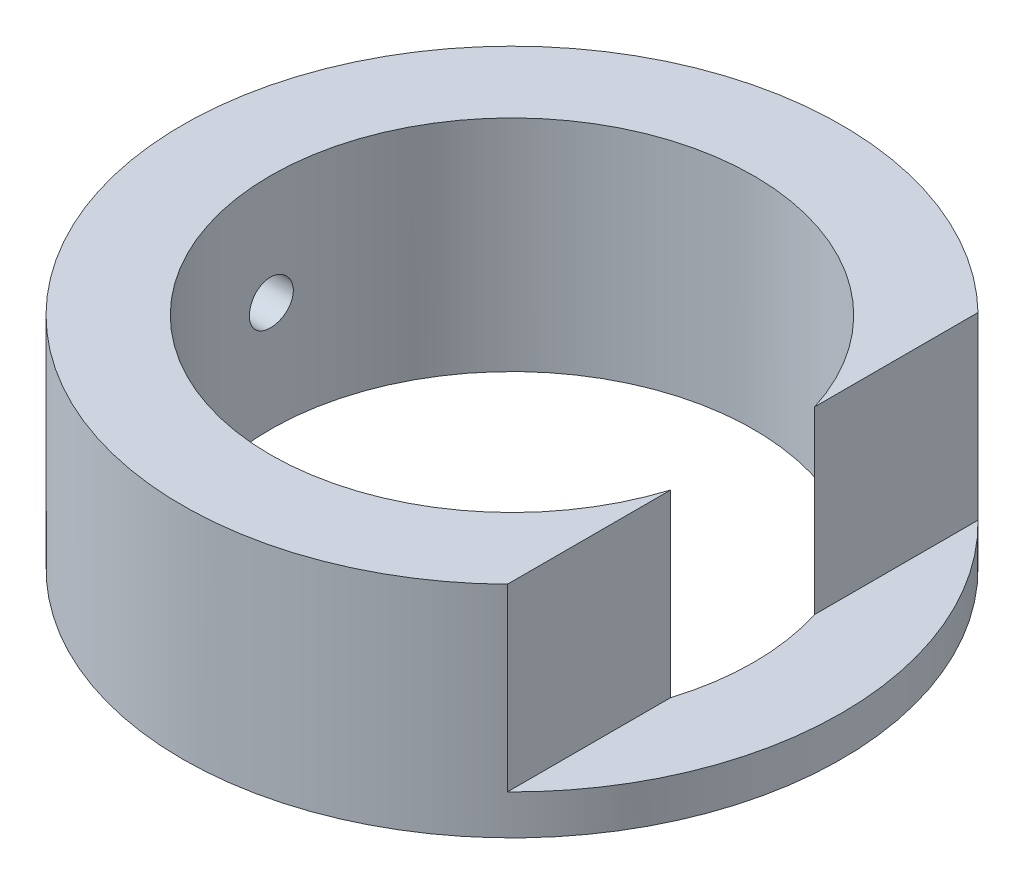
ISO-10303-21;
HEADER;
FILE_DESCRIPTION(('STEP AP214'),'2;1');
FILE_NAME('part.step','',(''),(''),'','','');
FILE_SCHEMA(('AUTOMOTIVE_DESIGN { 1 0 10303 214 1 1 1 1 }'));
ENDSEC;
DATA;
#1=APPLICATION_CONTEXT('core data for automotive mechanical design processes');
#2=APPLICATION_PROTOCOL_DEFINITION('international standard','automotive_design',2000,#1);
#3=PRODUCT_CONTEXT('',#1,'mechanical');
#4=PRODUCT('Part','Part','',(#3));
#5=PRODUCT_RELATED_PRODUCT_CATEGORY('part','',(#4));
#6=PRODUCT_DEFINITION_FORMATION('','',#4);
#7=PRODUCT_DEFINITION_CONTEXT('part definition',#1,'design');
#8=PRODUCT_DEFINITION('design','',#6,#7);
#9=PRODUCT_DEFINITION_SHAPE('','',#8);
#10=(LENGTH_UNIT() NAMED_UNIT(*) SI_UNIT(.MILLI.,.METRE.));
#11=(NAMED_UNIT(*) PLANE_ANGLE_UNIT() SI_UNIT($,.RADIAN.));
#12=(NAMED_UNIT(*) SI_UNIT($,.STERADIAN.) SOLID_ANGLE_UNIT());
#13=UNCERTAINTY_MEASURE_WITH_UNIT(LENGTH_MEASURE(1.E-05),#10,'distance_accuracy_value','');
#14=(GEOMETRIC_REPRESENTATION_CONTEXT(3) GLOBAL_UNCERTAINTY_ASSIGNED_CONTEXT((#13)) GLOBAL_UNIT_ASSIGNED_CONTEXT((#10,
#11,#12)) REPRESENTATION_CONTEXT('',''));
#15=CARTESIAN_POINT('',(0.,0.,0.));
#16=DIRECTION('',(0.,0.,1.));
#17=DIRECTION('',(1.,0.,0.));
#18=AXIS2_PLACEMENT_3D('',#15,#16,#17);
#19=CARTESIAN_POINT('',(0.,8.,0.));
#20=DIRECTION('',(0.,-1.,0.));
#21=DIRECTION('',(0.,0.,-1.));
#22=AXIS2_PLACEMENT_3D('',#19,#20,#21);
#23=CYLINDRICAL_SURFACE('',#22,24.);
#24=CARTESIAN_POINT('',(-23.9466072753532,0.,-1.6));
#25=CARTESIAN_POINT('',(-23.9466079884567,0.089765495326951,-1.59999605489651));
#26=CARTESIAN_POINT('',(-23.9471174424527,0.179593536191976,-1.59242038032986));
#27=CARTESIAN_POINT('',(-23.9491004050786,0.356768348813025,-1.56230876160442));
#28=CARTESIAN_POINT('',(-23.9505750305274,0.444112123656424,-1.539755486128));
#29=CARTESIAN_POINT('',(-23.9543205686877,0.613726414287811,-1.48034014706031));
#30=CARTESIAN_POINT('',(-23.9565910555038,0.695999615897359,-1.44348573542061));
#31=CARTESIAN_POINT('',(-23.9616719480995,0.853170896685812,-1.35652689360413));
#32=CARTESIAN_POINT('',(-23.9644822316654,0.928070639469401,-1.30642546167468));
#33=CARTESIAN_POINT('',(-23.9703314336049,1.06851673947136,-1.194302203398));
#34=CARTESIAN_POINT('',(-23.9733706872729,1.13404895613161,-1.13226268052111));
#35=CARTESIAN_POINT('',(-23.9793322683734,1.25377866448456,-0.998061063479044));
#36=CARTESIAN_POINT('',(-23.9822545908843,1.30797567948711,-0.925898543814863));
#37=CARTESIAN_POINT('',(-23.987655988035,1.40354067991656,-0.773418683512618));
#38=CARTESIAN_POINT('',(-23.9901346541588,1.44489686707094,-0.693093932733775));
#39=CARTESIAN_POINT('',(-23.9943659047901,1.51353073724957,-0.526621652966222));
#40=CARTESIAN_POINT('',(-23.9961184979421,1.5408085878893,-0.440474193316007));
#41=CARTESIAN_POINT('',(-23.9986978083835,1.58047196127163,-0.264938984695941));
#42=CARTESIAN_POINT('',(-23.9995259110076,1.59287976859937,-0.175556291756176));
#43=CARTESIAN_POINT('',(-24.0001676046847,1.60251967440014,0.00402670339663554));
#44=CARTESIAN_POINT('',(-23.9999812084918,1.59975196365559,0.0942269953168214));
#45=CARTESIAN_POINT('',(-23.9986160607391,1.57913775159132,0.272733763022197));
#46=CARTESIAN_POINT('',(-23.9974388866786,1.56131522013132,0.361043020617371));
#47=CARTESIAN_POINT('',(-23.9942265068173,1.51113449308461,0.533413663499482));
#48=CARTESIAN_POINT('',(-23.9921912953873,1.47877620213524,0.617475020913808));
#49=CARTESIAN_POINT('',(-23.9874892415061,1.40041542248772,0.779040497774637));
#50=CARTESIAN_POINT('',(-23.9848218975772,1.35440209375073,0.856539344515155));
#51=CARTESIAN_POINT('',(-23.9791556905921,1.25004527072849,1.00272231691473));
#52=CARTESIAN_POINT('',(-23.9761568232742,1.19170161793367,1.07140632923851));
#53=CARTESIAN_POINT('',(-23.9701580988274,1.06420498179405,1.19814989242806));
#54=CARTESIAN_POINT('',(-23.9671582511236,0.995031189379639,1.25618851308097));
#55=CARTESIAN_POINT('',(-23.9615015967701,0.847910699888306,1.35983235701574));
#56=CARTESIAN_POINT('',(-23.9588447902779,0.769963998781157,1.40543757458572));
#57=CARTESIAN_POINT('',(-23.9541742979447,0.607496761954464,1.48291867986946));
#58=CARTESIAN_POINT('',(-23.9521606550984,0.522975787223211,1.51479364978464));
#59=CARTESIAN_POINT('',(-23.9490050653016,0.349765503836451,1.56389481105159));
#60=CARTESIAN_POINT('',(-23.9478631066752,0.261076251031674,1.58112119862058));
#61=CARTESIAN_POINT('',(-23.9465818624714,0.0822296469810546,1.60041005065297));
#62=CARTESIAN_POINT('',(-23.946440652044,-0.00792455145452667,1.60250162574417));
#63=CARTESIAN_POINT('',(-23.9471717988874,-0.187302461379629,1.59153757461965));
#64=CARTESIAN_POINT('',(-23.9480441501465,-0.276526178384896,1.57848203824512));
#65=CARTESIAN_POINT('',(-23.9507023581874,-0.451427849937443,1.53761856010096));
#66=CARTESIAN_POINT('',(-23.9524873827678,-0.537108957941355,1.50982405688409));
#67=CARTESIAN_POINT('',(-23.9567690828779,-0.702590635022812,1.44028524943134));
#68=CARTESIAN_POINT('',(-23.9592657657492,-0.782391143425741,1.39854080128788));
#69=CARTESIAN_POINT('',(-23.964694106991,-0.933980006485567,1.30221281474259));
#70=CARTESIAN_POINT('',(-23.9676264230349,-1.00575595427775,1.2476097895846));
#71=CARTESIAN_POINT('',(-23.9735933093218,-1.13913318506514,1.12714295121444));
#72=CARTESIAN_POINT('',(-23.9766278806993,-1.20073435512037,1.0612790130227));
#73=CARTESIAN_POINT('',(-23.9824629814962,-1.31211191270268,0.920034605243947));
#74=CARTESIAN_POINT('',(-23.9852631332633,-1.36186944895695,0.844639252858362));
#75=CARTESIAN_POINT('',(-23.9903084513225,-1.44801824717356,0.686546932795258));
#76=CARTESIAN_POINT('',(-23.9925536214191,-1.48440960076502,0.603850015176943));
#77=CARTESIAN_POINT('',(-23.9962342108733,-1.54276029925169,0.433571018967644));
#78=CARTESIAN_POINT('',(-23.9976702967788,-1.56473152634671,0.34599302711624));
#79=CARTESIAN_POINT('',(-23.9995735734135,-1.59365716637005,0.168381219638007));
#80=CARTESIAN_POINT('',(-24.0000407752331,-1.60061175118617,0.0783474321333573));
#81=CARTESIAN_POINT('',(-23.9999536731883,-1.59930497426152,-0.101433793650784));
#82=CARTESIAN_POINT('',(-23.9994013483896,-1.59107309192282,-0.191181448651937));
#83=CARTESIAN_POINT('',(-23.9973412177882,-1.55968823886541,-0.368017117520941));
#84=CARTESIAN_POINT('',(-23.9958334103611,-1.53653524278194,-0.455105126867333));
#85=CARTESIAN_POINT('',(-23.992031734549,-1.47597221218899,-0.624153337885707));
#86=CARTESIAN_POINT('',(-23.9897378773095,-1.43856237982759,-0.706113612244804));
#87=CARTESIAN_POINT('',(-23.9846214858237,-1.3505515115943,-0.862594040786794));
#88=CARTESIAN_POINT('',(-23.9817989643348,-1.29995079402268,-0.937114374437835));
#89=CARTESIAN_POINT('',(-23.9759360998162,-1.18688503918503,-1.07674946572281));
#90=CARTESIAN_POINT('',(-23.9728953692793,-1.12439855275628,-1.14184683872277));
#91=CARTESIAN_POINT('',(-23.9669419535589,-0.989366461192643,-1.26065133311464));
#92=CARTESIAN_POINT('',(-23.9640292998328,-0.916818402778837,-1.31435566847771));
#93=CARTESIAN_POINT('',(-23.9586574498743,-0.76362954646178,-1.40889509372221));
#94=CARTESIAN_POINT('',(-23.9561988715031,-0.682977948982802,-1.44971270137515));
#95=CARTESIAN_POINT('',(-23.9520213724316,-0.516007843943544,-1.51717676401595));
#96=CARTESIAN_POINT('',(-23.9503015886841,-0.429696085156026,-1.54383976280886));
#97=CARTESIAN_POINT('',(-23.9482456321203,-0.285716256074988,-1.57533232049448));
#98=CARTESIAN_POINT('',(-23.9476340076448,-0.22897810007674,-1.58457067962477));
#99=CARTESIAN_POINT('',(-23.9468146014703,-0.114835162415575,-1.59690577644629));
#100=CARTESIAN_POINT('',(-23.9466068191222,-0.0574303818241373,-1.60000252400768));
#101=CARTESIAN_POINT('',(-23.9466072753532,0.,-1.6));
#102=B_SPLINE_CURVE_WITH_KNOTS('',3,(#24,#25,#26,#27,#28,#29,#30,#31,#32,#33,#34,#35,#36,#37,
#38,#39,#40,#41,#42,#43,#44,#45,#46,#47,#48,#49,#50,#51,#52,#53,#54,#55,#56,#57,#58,#59,#60,#61,
#62,#63,#64,#65,#66,#67,#68,#69,#70,#71,#72,#73,#74,#75,#76,#77,#78,#79,#80,#81,#82,#83,#84,#85,
#86,#87,#88,#89,#90,#91,#92,#93,#94,#95,#96,#97,#98,#99,#100,#101),.UNSPECIFIED.,.T.,.F.,(4,2,2,
2,2,2,2,2,2,2,2,2,2,2,2,2,2,2,2,2,2,2,2,2,2,2,2,2,2,2,2,2,2,2,2,2,2,2,4),(0.,0.269086823745503,
0.538485564885504,0.807740360119637,1.07693426600502,1.34653033131601,1.61613773193112,
1.88599212226862,2.15584329966825,2.42528956422427,2.69473244138428,2.96374712607202,
3.23276357567131,3.5019941576179,3.77122820080545,4.04098604762737,4.31074401837503,
4.58052001830028,4.85029240452872,5.11954576641186,5.38879753129596,5.6578042214503,
5.92681368676267,6.19623348092987,6.46565626545479,6.73550505931042,7.00535200323843,
7.27497631289523,7.54459753628452,7.81369593165496,8.08279478447338,8.35188982187367,
8.62097836652569,8.89055719858424,9.16020187707353,9.43021080111491,9.69990344196152,
9.87206072590439,10.0442177331738),.UNSPECIFIED.);
#103=CARTESIAN_POINT('',(-23.9466072753532,0.,-1.6));
#104=VERTEX_POINT('',#103);
#105=EDGE_CURVE('E155',#104,#104,#102,.T.);
#106=ORIENTED_EDGE('',*,*,#105,.T.);
#107=EDGE_LOOP('',(#106));
#108=FACE_BOUND('',#107,.T.);
#109=CARTESIAN_POINT('',(0.,-8.,0.));
#110=DIRECTION('',(0.,1.,0.));
#111=DIRECTION('',(0.,0.,1.));
#112=AXIS2_PLACEMENT_3D('',#109,#110,#111);
#113=CIRCLE('',#112,24.);
#114=CARTESIAN_POINT('',(0.,-8.,24.));
#115=VERTEX_POINT('',#114);
#116=EDGE_CURVE('E113',#115,#115,#113,.T.);
#117=ORIENTED_EDGE('',*,*,#116,.T.);
#118=EDGE_LOOP('',(#117));
#119=FACE_BOUND('',#118,.T.);
#120=DIRECTION('',(0.,-1.,0.));
#121=VECTOR('',#120,1.);
#122=CARTESIAN_POINT('',(16.8,8.,17.1394282285028));
#123=LINE('',#122,#121);
#124=CARTESIAN_POINT('',(16.8,8.,17.1394282285028));
#125=VERTEX_POINT('',#124);
#126=CARTESIAN_POINT('',(16.8,-5.1,17.1394282285028));
#127=VERTEX_POINT('',#126);
#128=EDGE_CURVE('E108',#125,#127,#123,.T.);
#129=ORIENTED_EDGE('',*,*,#128,.F.);
#130=CARTESIAN_POINT('',(0.,8.,0.));
#131=DIRECTION('',(0.,1.,0.));
#132=DIRECTION('',(0.,0.,1.));
#133=AXIS2_PLACEMENT_3D('',#130,#131,#132);
#134=CIRCLE('',#133,24.);
#135=CARTESIAN_POINT('',(16.8,8.,-17.1394282285028));
#136=VERTEX_POINT('',#135);
#137=EDGE_CURVE('E105',#136,#125,#134,.T.);
#138=ORIENTED_EDGE('',*,*,#137,.F.);
#139=DIRECTION('',(0.,-1.,0.));
#140=VECTOR('',#139,1.);
#141=CARTESIAN_POINT('',(16.8,8.,-17.1394282285028));
#142=LINE('',#141,#140);
#143=CARTESIAN_POINT('',(16.8,-5.1,-17.1394282285028));
#144=VERTEX_POINT('',#143);
#145=EDGE_CURVE('E66',#144,#136,#142,.F.);
#146=ORIENTED_EDGE('',*,*,#145,.F.);
#147=CARTESIAN_POINT('',(0.,-5.1,0.));
#148=DIRECTION('',(0.,1.,0.));
#149=DIRECTION('',(0.,0.,1.));
#150=AXIS2_PLACEMENT_3D('',#147,#148,#149);
#151=CIRCLE('',#150,24.);
#152=EDGE_CURVE('E86',#127,#144,#151,.T.);
#153=ORIENTED_EDGE('',*,*,#152,.F.);
#154=EDGE_LOOP('',(#129,#138,#146,#153));
#155=FACE_BOUND('',#154,.T.);
#156=ADVANCED_FACE('F43',(#108,#119,#155),#23,.T.);
#157=CARTESIAN_POINT('',(0.,8.,0.));
#158=DIRECTION('',(0.,1.,0.));
#159=DIRECTION('',(0.,0.,1.));
#160=AXIS2_PLACEMENT_3D('',#157,#158,#159);
#161=PLANE('',#160);
#162=ORIENTED_EDGE('',*,*,#137,.T.);
#163=DIRECTION('',(0.,0.,-1.));
#164=VECTOR('',#163,1.);
#165=CARTESIAN_POINT('',(16.8,8.,0.));
#166=LINE('',#165,#164);
#167=CARTESIAN_POINT('',(16.8,8.,5.2459508194416));
#168=VERTEX_POINT('',#167);
#169=EDGE_CURVE('E94',#125,#168,#166,.T.);
#170=ORIENTED_EDGE('',*,*,#169,.T.);
#171=CARTESIAN_POINT('',(0.,8.,0.));
#172=DIRECTION('',(0.,1.,0.));
#173=DIRECTION('',(0.,0.,1.));
#174=AXIS2_PLACEMENT_3D('',#171,#172,#173);
#175=CIRCLE('',#174,17.6);
#176=CARTESIAN_POINT('',(16.8,8.,-5.2459508194416));
#177=VERTEX_POINT('',#176);
#178=EDGE_CURVE('E110',#177,#168,#175,.T.);
#179=ORIENTED_EDGE('',*,*,#178,.F.);
#180=EDGE_CURVE('E102',#177,#136,#166,.T.);
#181=ORIENTED_EDGE('',*,*,#180,.T.);
#182=EDGE_LOOP('',(#162,#170,#179,#181));
#183=FACE_BOUND('',#182,.T.);
#184=ADVANCED_FACE('F126',(#183),#161,.T.);
#185=CARTESIAN_POINT('',(0.,-16.,0.));
#186=DIRECTION('',(0.,1.,0.));
#187=DIRECTION('',(0.,0.,1.));
#188=AXIS2_PLACEMENT_3D('',#185,#186,#187);
#189=CYLINDRICAL_SURFACE('',#188,17.6);
#190=CARTESIAN_POINT('',(-17.5271218401653,0.,-1.6));
#191=CARTESIAN_POINT('',(-17.5271228012981,-0.0896732461140318,-1.59999609640773));
#192=CARTESIAN_POINT('',(-17.5278174393583,-0.179406782170176,-1.59243591561769));
#193=CARTESIAN_POINT('',(-17.5305207555493,-0.356388849469847,-1.5623894472267));
#194=CARTESIAN_POINT('',(-17.5325309049383,-0.443634484117899,-1.53988644727184));
#195=CARTESIAN_POINT('',(-17.537635708172,-0.613051974519873,-1.48061247419978));
#196=CARTESIAN_POINT('',(-17.5407297286625,-0.695226760485367,-1.44384983228472));
#197=CARTESIAN_POINT('',(-17.5476528693525,-0.852220601970569,-1.35711547634161));
#198=CARTESIAN_POINT('',(-17.5514818371806,-0.927041177334273,-1.30714649948326));
#199=CARTESIAN_POINT('',(-17.5594564517981,-1.06744813452981,-1.19525483531658));
#200=CARTESIAN_POINT('',(-17.5636029226641,-1.1330091376734,-1.13330035738335));
#201=CARTESIAN_POINT('',(-17.5717378251957,-1.25281765027289,-0.999263953007114));
#202=CARTESIAN_POINT('',(-17.5757262498105,-1.30706465545532,-0.927181575395491));
#203=CARTESIAN_POINT('',(-17.5831036440088,-1.40279134419831,-0.774782138676933));
#204=CARTESIAN_POINT('',(-17.5864915666793,-1.44424882190523,-0.694451076409186));
#205=CARTESIAN_POINT('',(-17.5922773073976,-1.51307758784628,-0.527932049375328));
#206=CARTESIAN_POINT('',(-17.5946751457106,-1.54044916439685,-0.441744204529316));
#207=CARTESIAN_POINT('',(-17.5982047748331,-1.58025541674378,-0.266212701131962));
#208=CARTESIAN_POINT('',(-17.5993400718216,-1.59273146575679,-0.176878496632251));
#209=CARTESIAN_POINT('',(-17.6002286029883,-1.60252046367877,0.00262262886256146));
#210=CARTESIAN_POINT('',(-17.5999818672508,-1.59983374265185,0.0927895316887787));
#211=CARTESIAN_POINT('',(-17.5981370158678,-1.5794071928367,0.271115871787672));
#212=CARTESIAN_POINT('',(-17.5965428942699,-1.56171185346267,0.359280452217604));
#213=CARTESIAN_POINT('',(-17.5921870995787,-1.51183960680641,0.531383020191439));
#214=CARTESIAN_POINT('',(-17.5894254136027,-1.47966253973521,0.61532096108794));
#215=CARTESIAN_POINT('',(-17.5830382217372,-1.40169098960089,0.776728555471189));
#216=CARTESIAN_POINT('',(-17.5794114599713,-1.35587668443867,0.854188581739067));
#217=CARTESIAN_POINT('',(-17.5717014215582,-1.25194554992784,1.00033647712743));
#218=CARTESIAN_POINT('',(-17.5676181338661,-1.19382842290286,1.06902413392912));
#219=CARTESIAN_POINT('',(-17.5594362182353,-1.06669086212899,1.19593782279452));
#220=CARTESIAN_POINT('',(-17.5553375882317,-0.997631751092063,1.25412511617024));
#221=CARTESIAN_POINT('',(-17.5476017320779,-0.85070504662331,1.35808679755566));
#222=CARTESIAN_POINT('',(-17.5439645064216,-0.772837443763532,1.40386117227931));
#223=CARTESIAN_POINT('',(-17.5375627634779,-0.610475820216552,1.48169673111026));
#224=CARTESIAN_POINT('',(-17.5347983846671,-0.525980750737606,1.51375573956884));
#225=CARTESIAN_POINT('',(-17.5304581263554,-0.35277642341785,1.56322099562006));
#226=CARTESIAN_POINT('',(-17.5288822170393,-0.264067271355436,1.58062761079978));
#227=CARTESIAN_POINT('',(-17.5271023225377,-0.0852923632235829,1.60024458852406));
#228=CARTESIAN_POINT('',(-17.5268934535405,0.00476741021723388,1.60250904771621));
#229=CARTESIAN_POINT('',(-17.5278584007661,0.183985212186461,1.59191929668892));
#230=CARTESIAN_POINT('',(-17.5290322015989,0.273143250740628,1.57906525474825));
#231=CARTESIAN_POINT('',(-17.5326257833694,0.447870383172638,1.53864854906566));
#232=CARTESIAN_POINT('',(-17.5350434132774,0.533445398009538,1.51111127495134));
#233=CARTESIAN_POINT('',(-17.54085048325,0.698761009389114,1.44213564489479));
#234=CARTESIAN_POINT('',(-17.5442399418066,0.778501494875714,1.40069702443422));
#235=CARTESIAN_POINT('',(-17.5516205987939,0.930131637194167,1.30495869717877));
#236=CARTESIAN_POINT('',(-17.5556134682466,1.0019985053166,1.25062302846669));
#237=CARTESIAN_POINT('',(-17.5637454839326,1.13561072149889,1.13068476210677));
#238=CARTESIAN_POINT('',(-17.567884633157,1.19735586243259,1.06508193394943));
#239=CARTESIAN_POINT('',(-17.5758574633901,1.30915737922416,0.924237406528136));
#240=CARTESIAN_POINT('',(-17.5796902020323,1.35917854539915,0.848967697313867));
#241=CARTESIAN_POINT('',(-17.5866047274314,1.44587030678174,0.691065074053422));
#242=CARTESIAN_POINT('',(-17.5896865229084,1.48254105702164,0.608432245525682));
#243=CARTESIAN_POINT('',(-17.5947476281189,1.54143091909016,0.438273781183334));
#244=CARTESIAN_POINT('',(-17.5967285814919,1.56367158447764,0.350755655668379));
#245=CARTESIAN_POINT('',(-17.5993715089044,1.5931403473077,0.17320849134636));
#246=CARTESIAN_POINT('',(-17.600033513133,1.6003687883605,0.0831795100573061));
#247=CARTESIAN_POINT('',(-17.5999639727235,1.59960355644944,-0.096487244856484));
#248=CARTESIAN_POINT('',(-17.5992374430177,1.59166466299323,-0.186125258804589));
#249=CARTESIAN_POINT('',(-17.5964823696277,1.56090462726718,-0.362789006001383));
#250=CARTESIAN_POINT('',(-17.5944538244707,1.53808346816263,-0.449814736294961));
#251=CARTESIAN_POINT('',(-17.5893221782397,1.47822119316876,-0.618785371341275));
#252=CARTESIAN_POINT('',(-17.5862191723996,1.44118133750843,-0.700730725629582));
#253=CARTESIAN_POINT('',(-17.579285210161,1.353939138647,-0.857249224104575));
#254=CARTESIAN_POINT('',(-17.5754542621213,1.30373694658374,-0.93182245292889));
#255=CARTESIAN_POINT('',(-17.5674775395075,1.1913894211286,-1.07176046449396));
#256=CARTESIAN_POINT('',(-17.563330722459,1.12920340419422,-1.13709252572568));
#257=CARTESIAN_POINT('',(-17.555198508358,0.994730523679903,-1.25642051370752));
#258=CARTESIAN_POINT('',(-17.5512131504793,0.922441227514409,-1.31041370251755));
#259=CARTESIAN_POINT('',(-17.5438458243121,0.769647556246668,-1.40561936045527));
#260=CARTESIAN_POINT('',(-17.5404651772795,0.689125782247221,-1.44680398515099));
#261=CARTESIAN_POINT('',(-17.5347059723086,0.522332496796044,-1.51501452187684));
#262=CARTESIAN_POINT('',(-17.5323262722903,0.436067669109336,-1.54205657919478));
#263=CARTESIAN_POINT('',(-17.5294452941438,0.29108549487784,-1.57438902854414));
#264=CARTESIAN_POINT('',(-17.528578053693,0.233298289963955,-1.5839802219706));
#265=CARTESIAN_POINT('',(-17.5274160140342,0.117015947380405,-1.5967869708799));
#266=CARTESIAN_POINT('',(-17.5271212129295,0.0585208120569148,-1.60000254748656));
#267=CARTESIAN_POINT('',(-17.5271218401653,0.,-1.6));
#268=B_SPLINE_CURVE_WITH_KNOTS('',3,(#190,#191,#192,#193,#194,#195,#196,#197,#198,#199,#200,
#201,#202,#203,#204,#205,#206,#207,#208,#209,#210,#211,#212,#213,#214,#215,#216,#217,#218,#219,
#220,#221,#222,#223,#224,#225,#226,#227,#228,#229,#230,#231,#232,#233,#234,#235,#236,#237,#238,
#239,#240,#241,#242,#243,#244,#245,#246,#247,#248,#249,#250,#251,#252,#253,#254,#255,#256,#257,
#258,#259,#260,#261,#262,#263,#264,#265,#266,#267),.UNSPECIFIED.,.T.,.F.,(4,2,2,2,2,2,2,2,2,2,2,
2,2,2,2,2,2,2,2,2,2,2,2,2,2,2,2,2,2,2,2,2,2,2,2,2,2,2,4),(0.,0.268806052092242,
0.537913249858854,0.806863457874112,1.07575796642133,1.34537572581568,1.61500549971093,
1.88510081799266,2.15519060762398,2.42452844841643,2.69386042626882,2.96239681373725,
3.23093616426429,3.49986776612967,3.76880587574857,4.03871674364099,4.3086279004286,
4.57858185697139,4.84852904093139,5.11751129782736,5.38649056080391,5.65500621731593,
5.92352698350174,6.19280547139034,6.46208946897658,6.73217210982519,7.00225161422654,
7.27192677880777,7.5415957708086,7.81029264648815,8.07898982611601,8.34766319611959,
8.61633348118947,8.88593246818891,9.1555964792293,9.42584267789382,9.69577968377303,
9.87120324939169,10.0466262337927),.UNSPECIFIED.);
#269=CARTESIAN_POINT('',(-17.5271218401653,0.,-1.6));
#270=VERTEX_POINT('',#269);
#271=EDGE_CURVE('E50',#270,#270,#268,.T.);
#272=ORIENTED_EDGE('',*,*,#271,.T.);
#273=EDGE_LOOP('',(#272));
#274=FACE_BOUND('',#273,.T.);
#275=CARTESIAN_POINT('',(0.,-8.,0.));
#276=DIRECTION('',(0.,1.,0.));
#277=DIRECTION('',(0.,0.,1.));
#278=AXIS2_PLACEMENT_3D('',#275,#276,#277);
#279=CIRCLE('',#278,17.6);
#280=CARTESIAN_POINT('',(0.,-8.,17.6));
#281=VERTEX_POINT('',#280);
#282=EDGE_CURVE('E103',#281,#281,#279,.T.);
#283=ORIENTED_EDGE('',*,*,#282,.F.);
#284=EDGE_LOOP('',(#283));
#285=FACE_BOUND('',#284,.T.);
#286=DIRECTION('',(0.,1.,0.));
#287=VECTOR('',#286,1.);
#288=CARTESIAN_POINT('',(16.8,-16.,-5.2459508194416));
#289=LINE('',#288,#287);
#290=CARTESIAN_POINT('',(16.8,-5.1,-5.2459508194416));
#291=VERTEX_POINT('',#290);
#292=EDGE_CURVE('E11',#177,#291,#289,.F.);
#293=ORIENTED_EDGE('',*,*,#292,.F.);
#294=ORIENTED_EDGE('',*,*,#178,.T.);
#295=DIRECTION('',(0.,1.,0.));
#296=VECTOR('',#295,1.);
#297=CARTESIAN_POINT('',(16.8,-16.,5.2459508194416));
#298=LINE('',#297,#296);
#299=CARTESIAN_POINT('',(16.8,-5.1,5.2459508194416));
#300=VERTEX_POINT('',#299);
#301=EDGE_CURVE('E60',#300,#168,#298,.T.);
#302=ORIENTED_EDGE('',*,*,#301,.F.);
#303=CARTESIAN_POINT('',(0.,-5.1,0.));
#304=DIRECTION('',(0.,1.,0.));
#305=DIRECTION('',(0.,0.,1.));
#306=AXIS2_PLACEMENT_3D('',#303,#304,#305);
#307=CIRCLE('',#306,17.6);
#308=EDGE_CURVE('E119',#291,#300,#307,.F.);
#309=ORIENTED_EDGE('',*,*,#308,.F.);
#310=EDGE_LOOP('',(#293,#294,#302,#309));
#311=FACE_BOUND('',#310,.T.);
#312=ADVANCED_FACE('F129',(#274,#285,#311),#189,.F.);
#313=CARTESIAN_POINT('',(0.,-8.,0.));
#314=DIRECTION('',(0.,1.,0.));
#315=DIRECTION('',(0.,0.,1.));
#316=AXIS2_PLACEMENT_3D('',#313,#314,#315);
#317=PLANE('',#316);
#318=ORIENTED_EDGE('',*,*,#282,.T.);
#319=EDGE_LOOP('',(#318));
#320=FACE_BOUND('',#319,.T.);
#321=ORIENTED_EDGE('',*,*,#116,.F.);
#322=EDGE_LOOP('',(#321));
#323=FACE_BOUND('',#322,.T.);
#324=ADVANCED_FACE('F133',(#320,#323),#317,.F.);
#325=CARTESIAN_POINT('',(16.8,10.,-48.));
#326=DIRECTION('',(1.,0.,0.));
#327=DIRECTION('',(0.,0.,-1.));
#328=AXIS2_PLACEMENT_3D('',#325,#326,#327);
#329=PLANE('',#328);
#330=ORIENTED_EDGE('',*,*,#145,.T.);
#331=ORIENTED_EDGE('',*,*,#180,.F.);
#332=ORIENTED_EDGE('',*,*,#292,.T.);
#333=DIRECTION('',(0.,0.,1.));
#334=VECTOR('',#333,1.);
#335=CARTESIAN_POINT('',(16.8,-5.1,-48.));
#336=LINE('',#335,#334);
#337=EDGE_CURVE('E65',#144,#291,#336,.T.);
#338=ORIENTED_EDGE('',*,*,#337,.F.);
#339=EDGE_LOOP('',(#330,#331,#332,#338));
#340=FACE_BOUND('',#339,.T.);
#341=ADVANCED_FACE('F96',(#340),#329,.T.);
#342=ORIENTED_EDGE('',*,*,#128,.T.);
#343=EDGE_CURVE('E93',#300,#127,#336,.T.);
#344=ORIENTED_EDGE('',*,*,#343,.F.);
#345=ORIENTED_EDGE('',*,*,#301,.T.);
#346=ORIENTED_EDGE('',*,*,#169,.F.);
#347=EDGE_LOOP('',(#342,#344,#345,#346));
#348=FACE_BOUND('',#347,.T.);
#349=ADVANCED_FACE('F124',(#348),#329,.T.);
#350=CARTESIAN_POINT('',(0.,-5.1,0.));
#351=DIRECTION('',(0.,1.,0.));
#352=DIRECTION('',(0.,0.,1.));
#353=AXIS2_PLACEMENT_3D('',#350,#351,#352);
#354=PLANE('',#353);
#355=ORIENTED_EDGE('',*,*,#152,.T.);
#356=ORIENTED_EDGE('',*,*,#337,.T.);
#357=ORIENTED_EDGE('',*,*,#308,.T.);
#358=ORIENTED_EDGE('',*,*,#343,.T.);
#359=EDGE_LOOP('',(#355,#356,#357,#358));
#360=FACE_BOUND('',#359,.T.);
#361=ADVANCED_FACE('F90',(#360),#354,.T.);
#362=CARTESIAN_POINT('',(-60.,0.,0.));
#363=DIRECTION('',(1.,0.,0.));
#364=DIRECTION('',(0.,0.,-1.));
#365=AXIS2_PLACEMENT_3D('',#362,#363,#364);
#366=CYLINDRICAL_SURFACE('',#365,1.6);
#367=ORIENTED_EDGE('',*,*,#271,.F.);
#368=EDGE_LOOP('',(#367));
#369=FACE_BOUND('',#368,.T.);
#370=ORIENTED_EDGE('',*,*,#105,.F.);
#371=EDGE_LOOP('',(#370));
#372=FACE_BOUND('',#371,.T.);
#373=ADVANCED_FACE('F159',(#369,#372),#366,.F.);
#374=CLOSED_SHELL('',(#156,#184,#312,#324,#341,#349,#361,#373));
#375=MANIFOLD_SOLID_BREP('B2',#374);
#376=ADVANCED_BREP_SHAPE_REPRESENTATION('',(#18,#375),#14);
#377=SHAPE_DEFINITION_REPRESENTATION(#9,#376);
ENDSEC;
END-ISO-10303-21;
